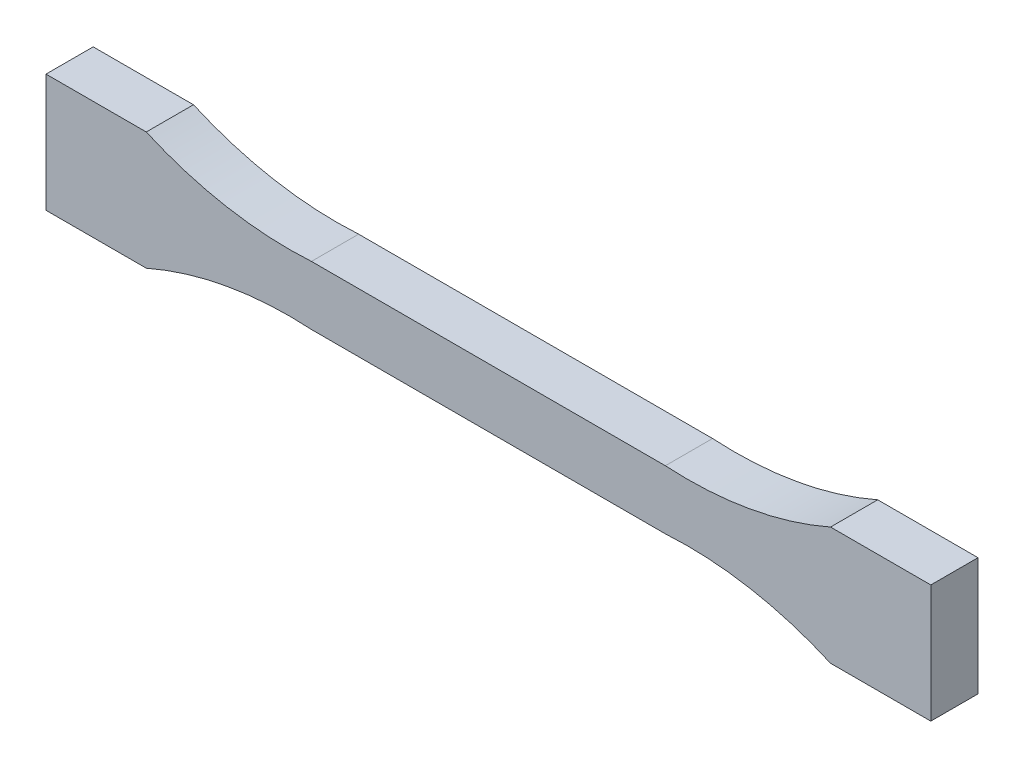
ISO-10303-21;
HEADER;
FILE_DESCRIPTION(('STEP AP214'),'2;1');
FILE_NAME('part.step','',(''),(''),'','','');
FILE_SCHEMA(('AUTOMOTIVE_DESIGN { 1 0 10303 214 1 1 1 1 }'));
ENDSEC;
DATA;
#1=APPLICATION_CONTEXT('core data for automotive mechanical design processes');
#2=APPLICATION_PROTOCOL_DEFINITION('international standard','automotive_design',2000,#1);
#3=PRODUCT_CONTEXT('',#1,'mechanical');
#4=PRODUCT('Part','Part','',(#3));
#5=PRODUCT_RELATED_PRODUCT_CATEGORY('part','',(#4));
#6=PRODUCT_DEFINITION_FORMATION('','',#4);
#7=PRODUCT_DEFINITION_CONTEXT('part definition',#1,'design');
#8=PRODUCT_DEFINITION('design','',#6,#7);
#9=PRODUCT_DEFINITION_SHAPE('','',#8);
#10=(LENGTH_UNIT() NAMED_UNIT(*) SI_UNIT(.MILLI.,.METRE.));
#11=(NAMED_UNIT(*) PLANE_ANGLE_UNIT() SI_UNIT($,.RADIAN.));
#12=(NAMED_UNIT(*) SI_UNIT($,.STERADIAN.) SOLID_ANGLE_UNIT());
#13=UNCERTAINTY_MEASURE_WITH_UNIT(LENGTH_MEASURE(1.E-05),#10,'distance_accuracy_value','');
#14=(GEOMETRIC_REPRESENTATION_CONTEXT(3) GLOBAL_UNCERTAINTY_ASSIGNED_CONTEXT((#13)) GLOBAL_UNIT_ASSIGNED_CONTEXT((#10,
#11,#12)) REPRESENTATION_CONTEXT('',''));
#15=CARTESIAN_POINT('',(0.,0.,0.));
#16=DIRECTION('',(0.,0.,1.));
#17=DIRECTION('',(1.,0.,0.));
#18=AXIS2_PLACEMENT_3D('',#15,#16,#17);
#19=CARTESIAN_POINT('',(16.8765623141642,34.9412510406806,4.));
#20=DIRECTION('',(0.,0.,-1.));
#21=DIRECTION('',(-1.,0.,0.));
#22=AXIS2_PLACEMENT_3D('',#19,#20,#21);
#23=CYLINDRICAL_SURFACE('',#22,30.);
#24=CARTESIAN_POINT('',(16.8765623141642,34.9412510406806,0.));
#25=DIRECTION('',(0.,0.,-1.));
#26=DIRECTION('',(1.,0.,0.));
#27=AXIS2_PLACEMENT_3D('',#24,#25,#26);
#28=CIRCLE('',#27,30.);
#29=CARTESIAN_POINT('',(29.,7.5,0.));
#30=VERTEX_POINT('',#29);
#31=CARTESIAN_POINT('',(15.,5.,0.));
#32=VERTEX_POINT('',#31);
#33=EDGE_CURVE('E164',#30,#32,#28,.T.);
#34=ORIENTED_EDGE('',*,*,#33,.T.);
#35=DIRECTION('',(0.,0.,-1.));
#36=VECTOR('',#35,1.);
#37=CARTESIAN_POINT('',(15.,5.,4.));
#38=LINE('',#37,#36);
#39=CARTESIAN_POINT('',(15.,5.,4.));
#40=VERTEX_POINT('',#39);
#41=EDGE_CURVE('E11',#40,#32,#38,.T.);
#42=ORIENTED_EDGE('',*,*,#41,.F.);
#43=CARTESIAN_POINT('',(16.8765623141642,34.9412510406806,4.));
#44=DIRECTION('',(0.,0.,-1.));
#45=DIRECTION('',(1.,0.,0.));
#46=AXIS2_PLACEMENT_3D('',#43,#44,#45);
#47=CIRCLE('',#46,30.);
#48=CARTESIAN_POINT('',(29.,7.5,4.));
#49=VERTEX_POINT('',#48);
#50=EDGE_CURVE('E198',#49,#40,#47,.T.);
#51=ORIENTED_EDGE('',*,*,#50,.F.);
#52=DIRECTION('',(0.,0.,-1.));
#53=VECTOR('',#52,1.);
#54=CARTESIAN_POINT('',(29.,7.5,4.));
#55=LINE('',#54,#53);
#56=EDGE_CURVE('E160',#49,#30,#55,.T.);
#57=ORIENTED_EDGE('',*,*,#56,.T.);
#58=EDGE_LOOP('',(#34,#42,#51,#57));
#59=FACE_BOUND('',#58,.T.);
#60=ADVANCED_FACE('F39',(#59),#23,.F.);
#61=CARTESIAN_POINT('',(-15.,5.,4.));
#62=DIRECTION('',(0.,-1.,0.));
#63=DIRECTION('',(0.,0.,-1.));
#64=AXIS2_PLACEMENT_3D('',#61,#62,#63);
#65=PLANE('',#64);
#66=DIRECTION('',(-1.,0.,0.));
#67=VECTOR('',#66,1.);
#68=CARTESIAN_POINT('',(-15.,5.,0.));
#69=LINE('',#68,#67);
#70=CARTESIAN_POINT('',(-15.,5.,0.));
#71=VERTEX_POINT('',#70);
#72=EDGE_CURVE('E168',#32,#71,#69,.T.);
#73=ORIENTED_EDGE('',*,*,#72,.T.);
#74=DIRECTION('',(0.,0.,-1.));
#75=VECTOR('',#74,1.);
#76=CARTESIAN_POINT('',(-15.,5.,4.));
#77=LINE('',#76,#75);
#78=CARTESIAN_POINT('',(-15.,5.,4.));
#79=VERTEX_POINT('',#78);
#80=EDGE_CURVE('E48',#79,#71,#77,.T.);
#81=ORIENTED_EDGE('',*,*,#80,.F.);
#82=DIRECTION('',(-1.,0.,0.));
#83=VECTOR('',#82,1.);
#84=CARTESIAN_POINT('',(-15.,5.,4.));
#85=LINE('',#84,#83);
#86=EDGE_CURVE('E111',#40,#79,#85,.T.);
#87=ORIENTED_EDGE('',*,*,#86,.F.);
#88=ORIENTED_EDGE('',*,*,#41,.T.);
#89=EDGE_LOOP('',(#73,#81,#87,#88));
#90=FACE_BOUND('',#89,.T.);
#91=ADVANCED_FACE('F292',(#90),#65,.F.);
#92=CARTESIAN_POINT('',(-16.8765623141642,34.9412510406806,4.));
#93=DIRECTION('',(0.,0.,-1.));
#94=DIRECTION('',(-1.,0.,0.));
#95=AXIS2_PLACEMENT_3D('',#92,#93,#94);
#96=CYLINDRICAL_SURFACE('',#95,30.);
#97=CARTESIAN_POINT('',(-16.8765623141642,34.9412510406806,0.));
#98=DIRECTION('',(0.,0.,-1.));
#99=DIRECTION('',(-1.,0.,0.));
#100=AXIS2_PLACEMENT_3D('',#97,#98,#99);
#101=CIRCLE('',#100,30.);
#102=CARTESIAN_POINT('',(-29.,7.5,0.));
#103=VERTEX_POINT('',#102);
#104=EDGE_CURVE('E171',#71,#103,#101,.T.);
#105=ORIENTED_EDGE('',*,*,#104,.T.);
#106=DIRECTION('',(0.,0.,-1.));
#107=VECTOR('',#106,1.);
#108=CARTESIAN_POINT('',(-29.,7.5,4.));
#109=LINE('',#108,#107);
#110=CARTESIAN_POINT('',(-29.,7.5,4.));
#111=VERTEX_POINT('',#110);
#112=EDGE_CURVE('E225',#111,#103,#109,.T.);
#113=ORIENTED_EDGE('',*,*,#112,.F.);
#114=CARTESIAN_POINT('',(-16.8765623141642,34.9412510406806,4.));
#115=DIRECTION('',(0.,0.,-1.));
#116=DIRECTION('',(-1.,0.,0.));
#117=AXIS2_PLACEMENT_3D('',#114,#115,#116);
#118=CIRCLE('',#117,30.);
#119=EDGE_CURVE('E235',#79,#111,#118,.T.);
#120=ORIENTED_EDGE('',*,*,#119,.F.);
#121=ORIENTED_EDGE('',*,*,#80,.T.);
#122=EDGE_LOOP('',(#105,#113,#120,#121));
#123=FACE_BOUND('',#122,.T.);
#124=ADVANCED_FACE('F233',(#123),#96,.F.);
#125=CARTESIAN_POINT('',(-29.,7.5,4.));
#126=DIRECTION('',(0.,-1.,0.));
#127=DIRECTION('',(1.,0.,0.));
#128=AXIS2_PLACEMENT_3D('',#125,#126,#127);
#129=PLANE('',#128);
#130=DIRECTION('',(-1.,0.,0.));
#131=VECTOR('',#130,1.);
#132=CARTESIAN_POINT('',(-29.,7.5,0.));
#133=LINE('',#132,#131);
#134=CARTESIAN_POINT('',(-37.5,7.5,0.));
#135=VERTEX_POINT('',#134);
#136=EDGE_CURVE('E174',#103,#135,#133,.T.);
#137=ORIENTED_EDGE('',*,*,#136,.T.);
#138=DIRECTION('',(0.,0.,-1.));
#139=VECTOR('',#138,1.);
#140=CARTESIAN_POINT('',(-37.5,7.5,4.));
#141=LINE('',#140,#139);
#142=CARTESIAN_POINT('',(-37.5,7.5,4.));
#143=VERTEX_POINT('',#142);
#144=EDGE_CURVE('E221',#143,#135,#141,.T.);
#145=ORIENTED_EDGE('',*,*,#144,.F.);
#146=DIRECTION('',(-1.,0.,0.));
#147=VECTOR('',#146,1.);
#148=CARTESIAN_POINT('',(-29.,7.5,4.));
#149=LINE('',#148,#147);
#150=EDGE_CURVE('E254',#111,#143,#149,.T.);
#151=ORIENTED_EDGE('',*,*,#150,.F.);
#152=ORIENTED_EDGE('',*,*,#112,.T.);
#153=EDGE_LOOP('',(#137,#145,#151,#152));
#154=FACE_BOUND('',#153,.T.);
#155=ADVANCED_FACE('F244',(#154),#129,.F.);
#156=CARTESIAN_POINT('',(-37.5,7.5,4.));
#157=DIRECTION('',(1.,0.,0.));
#158=DIRECTION('',(0.,0.,-1.));
#159=AXIS2_PLACEMENT_3D('',#156,#157,#158);
#160=PLANE('',#159);
#161=DIRECTION('',(0.,-1.,0.));
#162=VECTOR('',#161,1.);
#163=CARTESIAN_POINT('',(-37.5,7.5,0.));
#164=LINE('',#163,#162);
#165=CARTESIAN_POINT('',(-37.5,-2.5,0.));
#166=VERTEX_POINT('',#165);
#167=EDGE_CURVE('E177',#135,#166,#164,.T.);
#168=ORIENTED_EDGE('',*,*,#167,.T.);
#169=DIRECTION('',(0.,0.,-1.));
#170=VECTOR('',#169,1.);
#171=CARTESIAN_POINT('',(-37.5,-2.5,4.));
#172=LINE('',#171,#170);
#173=CARTESIAN_POINT('',(-37.5,-2.5,4.));
#174=VERTEX_POINT('',#173);
#175=EDGE_CURVE('E217',#174,#166,#172,.T.);
#176=ORIENTED_EDGE('',*,*,#175,.F.);
#177=DIRECTION('',(0.,-1.,0.));
#178=VECTOR('',#177,1.);
#179=CARTESIAN_POINT('',(-37.5,7.5,4.));
#180=LINE('',#179,#178);
#181=EDGE_CURVE('E250',#143,#174,#180,.T.);
#182=ORIENTED_EDGE('',*,*,#181,.F.);
#183=ORIENTED_EDGE('',*,*,#144,.T.);
#184=EDGE_LOOP('',(#168,#176,#182,#183));
#185=FACE_BOUND('',#184,.T.);
#186=ADVANCED_FACE('F248',(#185),#160,.F.);
#187=CARTESIAN_POINT('',(-29.,-2.5,4.));
#188=DIRECTION('',(0.,1.,0.));
#189=DIRECTION('',(-1.,0.,0.));
#190=AXIS2_PLACEMENT_3D('',#187,#188,#189);
#191=PLANE('',#190);
#192=DIRECTION('',(1.,0.,0.));
#193=VECTOR('',#192,1.);
#194=CARTESIAN_POINT('',(-29.,-2.5,0.));
#195=LINE('',#194,#193);
#196=CARTESIAN_POINT('',(-29.,-2.5,0.));
#197=VERTEX_POINT('',#196);
#198=EDGE_CURVE('E180',#166,#197,#195,.T.);
#199=ORIENTED_EDGE('',*,*,#198,.T.);
#200=DIRECTION('',(0.,0.,-1.));
#201=VECTOR('',#200,1.);
#202=CARTESIAN_POINT('',(-29.,-2.5,4.));
#203=LINE('',#202,#201);
#204=CARTESIAN_POINT('',(-29.,-2.5,4.));
#205=VERTEX_POINT('',#204);
#206=EDGE_CURVE('E213',#205,#197,#203,.T.);
#207=ORIENTED_EDGE('',*,*,#206,.F.);
#208=DIRECTION('',(1.,0.,0.));
#209=VECTOR('',#208,1.);
#210=CARTESIAN_POINT('',(-29.,-2.5,4.));
#211=LINE('',#210,#209);
#212=EDGE_CURVE('E253',#174,#205,#211,.T.);
#213=ORIENTED_EDGE('',*,*,#212,.F.);
#214=ORIENTED_EDGE('',*,*,#175,.T.);
#215=EDGE_LOOP('',(#199,#207,#213,#214));
#216=FACE_BOUND('',#215,.T.);
#217=ADVANCED_FACE('F305',(#216),#191,.F.);
#218=CARTESIAN_POINT('',(-16.8765623141642,-29.9412510406806,4.));
#219=DIRECTION('',(0.,0.,-1.));
#220=DIRECTION('',(-1.,0.,0.));
#221=AXIS2_PLACEMENT_3D('',#218,#219,#220);
#222=CYLINDRICAL_SURFACE('',#221,30.);
#223=CARTESIAN_POINT('',(-16.8765623141642,-29.9412510406806,0.));
#224=DIRECTION('',(0.,0.,-1.));
#225=DIRECTION('',(-1.,0.,0.));
#226=AXIS2_PLACEMENT_3D('',#223,#224,#225);
#227=CIRCLE('',#226,30.);
#228=CARTESIAN_POINT('',(-15.,0.,0.));
#229=VERTEX_POINT('',#228);
#230=EDGE_CURVE('E183',#197,#229,#227,.T.);
#231=ORIENTED_EDGE('',*,*,#230,.T.);
#232=DIRECTION('',(0.,0.,-1.));
#233=VECTOR('',#232,1.);
#234=CARTESIAN_POINT('',(-15.,0.,4.));
#235=LINE('',#234,#233);
#236=CARTESIAN_POINT('',(-15.,0.,4.));
#237=VERTEX_POINT('',#236);
#238=EDGE_CURVE('E209',#237,#229,#235,.T.);
#239=ORIENTED_EDGE('',*,*,#238,.F.);
#240=CARTESIAN_POINT('',(-16.8765623141642,-29.9412510406806,4.));
#241=DIRECTION('',(0.,0.,-1.));
#242=DIRECTION('',(-1.,0.,0.));
#243=AXIS2_PLACEMENT_3D('',#240,#241,#242);
#244=CIRCLE('',#243,30.);
#245=EDGE_CURVE('E258',#205,#237,#244,.T.);
#246=ORIENTED_EDGE('',*,*,#245,.F.);
#247=ORIENTED_EDGE('',*,*,#206,.T.);
#248=EDGE_LOOP('',(#231,#239,#246,#247));
#249=FACE_BOUND('',#248,.T.);
#250=ADVANCED_FACE('F308',(#249),#222,.F.);
#251=CARTESIAN_POINT('',(-15.,0.,4.));
#252=DIRECTION('',(0.,1.,0.));
#253=DIRECTION('',(0.,0.,1.));
#254=AXIS2_PLACEMENT_3D('',#251,#252,#253);
#255=PLANE('',#254);
#256=DIRECTION('',(1.,0.,0.));
#257=VECTOR('',#256,1.);
#258=CARTESIAN_POINT('',(-15.,0.,0.));
#259=LINE('',#258,#257);
#260=CARTESIAN_POINT('',(15.,0.,0.));
#261=VERTEX_POINT('',#260);
#262=EDGE_CURVE('E186',#229,#261,#259,.T.);
#263=ORIENTED_EDGE('',*,*,#262,.T.);
#264=DIRECTION('',(0.,0.,-1.));
#265=VECTOR('',#264,1.);
#266=CARTESIAN_POINT('',(15.,0.,4.));
#267=LINE('',#266,#265);
#268=CARTESIAN_POINT('',(15.,0.,4.));
#269=VERTEX_POINT('',#268);
#270=EDGE_CURVE('E205',#269,#261,#267,.T.);
#271=ORIENTED_EDGE('',*,*,#270,.F.);
#272=DIRECTION('',(1.,0.,0.));
#273=VECTOR('',#272,1.);
#274=CARTESIAN_POINT('',(-15.,0.,4.));
#275=LINE('',#274,#273);
#276=EDGE_CURVE('E265',#237,#269,#275,.T.);
#277=ORIENTED_EDGE('',*,*,#276,.F.);
#278=ORIENTED_EDGE('',*,*,#238,.T.);
#279=EDGE_LOOP('',(#263,#271,#277,#278));
#280=FACE_BOUND('',#279,.T.);
#281=ADVANCED_FACE('F273',(#280),#255,.F.);
#282=CARTESIAN_POINT('',(16.8765623141642,-29.9412510406806,4.));
#283=DIRECTION('',(0.,0.,-1.));
#284=DIRECTION('',(-1.,0.,0.));
#285=AXIS2_PLACEMENT_3D('',#282,#283,#284);
#286=CYLINDRICAL_SURFACE('',#285,30.);
#287=CARTESIAN_POINT('',(16.8765623141642,-29.9412510406806,0.));
#288=DIRECTION('',(0.,0.,-1.));
#289=DIRECTION('',(1.,0.,0.));
#290=AXIS2_PLACEMENT_3D('',#287,#288,#289);
#291=CIRCLE('',#290,30.);
#292=CARTESIAN_POINT('',(29.,-2.5,0.));
#293=VERTEX_POINT('',#292);
#294=EDGE_CURVE('E189',#261,#293,#291,.T.);
#295=ORIENTED_EDGE('',*,*,#294,.T.);
#296=DIRECTION('',(0.,0.,-1.));
#297=VECTOR('',#296,1.);
#298=CARTESIAN_POINT('',(29.,-2.5,4.));
#299=LINE('',#298,#297);
#300=CARTESIAN_POINT('',(29.,-2.5,4.));
#301=VERTEX_POINT('',#300);
#302=EDGE_CURVE('E153',#301,#293,#299,.T.);
#303=ORIENTED_EDGE('',*,*,#302,.F.);
#304=CARTESIAN_POINT('',(16.8765623141642,-29.9412510406806,4.));
#305=DIRECTION('',(0.,0.,-1.));
#306=DIRECTION('',(1.,0.,0.));
#307=AXIS2_PLACEMENT_3D('',#304,#305,#306);
#308=CIRCLE('',#307,30.);
#309=EDGE_CURVE('E142',#269,#301,#308,.T.);
#310=ORIENTED_EDGE('',*,*,#309,.F.);
#311=ORIENTED_EDGE('',*,*,#270,.T.);
#312=EDGE_LOOP('',(#295,#303,#310,#311));
#313=FACE_BOUND('',#312,.T.);
#314=ADVANCED_FACE('F277',(#313),#286,.F.);
#315=CARTESIAN_POINT('',(29.,-2.5,4.));
#316=DIRECTION('',(0.,1.,0.));
#317=DIRECTION('',(-1.,0.,0.));
#318=AXIS2_PLACEMENT_3D('',#315,#316,#317);
#319=PLANE('',#318);
#320=DIRECTION('',(1.,0.,0.));
#321=VECTOR('',#320,1.);
#322=CARTESIAN_POINT('',(29.,-2.5,0.));
#323=LINE('',#322,#321);
#324=CARTESIAN_POINT('',(37.5,-2.5,0.));
#325=VERTEX_POINT('',#324);
#326=EDGE_CURVE('E151',#293,#325,#323,.T.);
#327=ORIENTED_EDGE('',*,*,#326,.T.);
#328=DIRECTION('',(0.,0.,-1.));
#329=VECTOR('',#328,1.);
#330=CARTESIAN_POINT('',(37.5,-2.5,4.));
#331=LINE('',#330,#329);
#332=CARTESIAN_POINT('',(37.5,-2.5,4.));
#333=VERTEX_POINT('',#332);
#334=EDGE_CURVE('E148',#333,#325,#331,.T.);
#335=ORIENTED_EDGE('',*,*,#334,.F.);
#336=DIRECTION('',(1.,0.,0.));
#337=VECTOR('',#336,1.);
#338=CARTESIAN_POINT('',(29.,-2.5,4.));
#339=LINE('',#338,#337);
#340=EDGE_CURVE('E136',#301,#333,#339,.T.);
#341=ORIENTED_EDGE('',*,*,#340,.F.);
#342=ORIENTED_EDGE('',*,*,#302,.T.);
#343=EDGE_LOOP('',(#327,#335,#341,#342));
#344=FACE_BOUND('',#343,.T.);
#345=ADVANCED_FACE('F149',(#344),#319,.F.);
#346=CARTESIAN_POINT('',(37.5,7.5,4.));
#347=DIRECTION('',(-1.,0.,0.));
#348=DIRECTION('',(0.,0.,1.));
#349=AXIS2_PLACEMENT_3D('',#346,#347,#348);
#350=PLANE('',#349);
#351=DIRECTION('',(0.,1.,0.));
#352=VECTOR('',#351,1.);
#353=CARTESIAN_POINT('',(37.5,7.5,0.));
#354=LINE('',#353,#352);
#355=CARTESIAN_POINT('',(37.5,7.5,0.));
#356=VERTEX_POINT('',#355);
#357=EDGE_CURVE('E97',#325,#356,#354,.T.);
#358=ORIENTED_EDGE('',*,*,#357,.T.);
#359=DIRECTION('',(0.,0.,-1.));
#360=VECTOR('',#359,1.);
#361=CARTESIAN_POINT('',(37.5,7.5,4.));
#362=LINE('',#361,#360);
#363=CARTESIAN_POINT('',(37.5,7.5,4.));
#364=VERTEX_POINT('',#363);
#365=EDGE_CURVE('E154',#364,#356,#362,.T.);
#366=ORIENTED_EDGE('',*,*,#365,.F.);
#367=DIRECTION('',(0.,1.,0.));
#368=VECTOR('',#367,1.);
#369=CARTESIAN_POINT('',(37.5,7.5,4.));
#370=LINE('',#369,#368);
#371=EDGE_CURVE('E140',#333,#364,#370,.T.);
#372=ORIENTED_EDGE('',*,*,#371,.F.);
#373=ORIENTED_EDGE('',*,*,#334,.T.);
#374=EDGE_LOOP('',(#358,#366,#372,#373));
#375=FACE_BOUND('',#374,.T.);
#376=ADVANCED_FACE('F156',(#375),#350,.F.);
#377=CARTESIAN_POINT('',(29.,7.5,4.));
#378=DIRECTION('',(0.,-1.,0.));
#379=DIRECTION('',(1.,0.,0.));
#380=AXIS2_PLACEMENT_3D('',#377,#378,#379);
#381=PLANE('',#380);
#382=DIRECTION('',(-1.,0.,0.));
#383=VECTOR('',#382,1.);
#384=CARTESIAN_POINT('',(29.,7.5,0.));
#385=LINE('',#384,#383);
#386=EDGE_CURVE('E103',#356,#30,#385,.T.);
#387=ORIENTED_EDGE('',*,*,#386,.T.);
#388=ORIENTED_EDGE('',*,*,#56,.F.);
#389=DIRECTION('',(-1.,0.,0.));
#390=VECTOR('',#389,1.);
#391=CARTESIAN_POINT('',(29.,7.5,4.));
#392=LINE('',#391,#390);
#393=EDGE_CURVE('E56',#364,#49,#392,.T.);
#394=ORIENTED_EDGE('',*,*,#393,.F.);
#395=ORIENTED_EDGE('',*,*,#365,.T.);
#396=EDGE_LOOP('',(#387,#388,#394,#395));
#397=FACE_BOUND('',#396,.T.);
#398=ADVANCED_FACE('F281',(#397),#381,.F.);
#399=CARTESIAN_POINT('',(16.8765623141642,34.9412510406806,4.));
#400=DIRECTION('',(0.,0.,1.));
#401=DIRECTION('',(1.,0.,0.));
#402=AXIS2_PLACEMENT_3D('',#399,#400,#401);
#403=PLANE('',#402);
#404=ORIENTED_EDGE('',*,*,#50,.T.);
#405=ORIENTED_EDGE('',*,*,#86,.T.);
#406=ORIENTED_EDGE('',*,*,#119,.T.);
#407=ORIENTED_EDGE('',*,*,#150,.T.);
#408=ORIENTED_EDGE('',*,*,#181,.T.);
#409=ORIENTED_EDGE('',*,*,#212,.T.);
#410=ORIENTED_EDGE('',*,*,#245,.T.);
#411=ORIENTED_EDGE('',*,*,#276,.T.);
#412=ORIENTED_EDGE('',*,*,#309,.T.);
#413=ORIENTED_EDGE('',*,*,#340,.T.);
#414=ORIENTED_EDGE('',*,*,#371,.T.);
#415=ORIENTED_EDGE('',*,*,#393,.T.);
#416=EDGE_LOOP('',(#404,#405,#406,#407,#408,#409,#410,#411,#412,#413,#414,#415));
#417=FACE_BOUND('',#416,.T.);
#418=ADVANCED_FACE('F138',(#417),#403,.T.);
#419=CARTESIAN_POINT('',(16.8765623141642,34.9412510406806,0.));
#420=DIRECTION('',(0.,0.,1.));
#421=DIRECTION('',(1.,0.,0.));
#422=AXIS2_PLACEMENT_3D('',#419,#420,#421);
#423=PLANE('',#422);
#424=ORIENTED_EDGE('',*,*,#33,.F.);
#425=ORIENTED_EDGE('',*,*,#386,.F.);
#426=ORIENTED_EDGE('',*,*,#357,.F.);
#427=ORIENTED_EDGE('',*,*,#326,.F.);
#428=ORIENTED_EDGE('',*,*,#294,.F.);
#429=ORIENTED_EDGE('',*,*,#262,.F.);
#430=ORIENTED_EDGE('',*,*,#230,.F.);
#431=ORIENTED_EDGE('',*,*,#198,.F.);
#432=ORIENTED_EDGE('',*,*,#167,.F.);
#433=ORIENTED_EDGE('',*,*,#136,.F.);
#434=ORIENTED_EDGE('',*,*,#104,.F.);
#435=ORIENTED_EDGE('',*,*,#72,.F.);
#436=EDGE_LOOP('',(#424,#425,#426,#427,#428,#429,#430,#431,#432,#433,#434,#435));
#437=FACE_BOUND('',#436,.T.);
#438=ADVANCED_FACE('F239',(#437),#423,.F.);
#439=CLOSED_SHELL('',(#60,#91,#124,#155,#186,#217,#250,#281,#314,#345,#376,#398,#418,#438));
#440=MANIFOLD_SOLID_BREP('B2',#439);
#441=ADVANCED_BREP_SHAPE_REPRESENTATION('',(#18,#440),#14);
#442=SHAPE_DEFINITION_REPRESENTATION(#9,#441);
ENDSEC;
END-ISO-10303-21;
